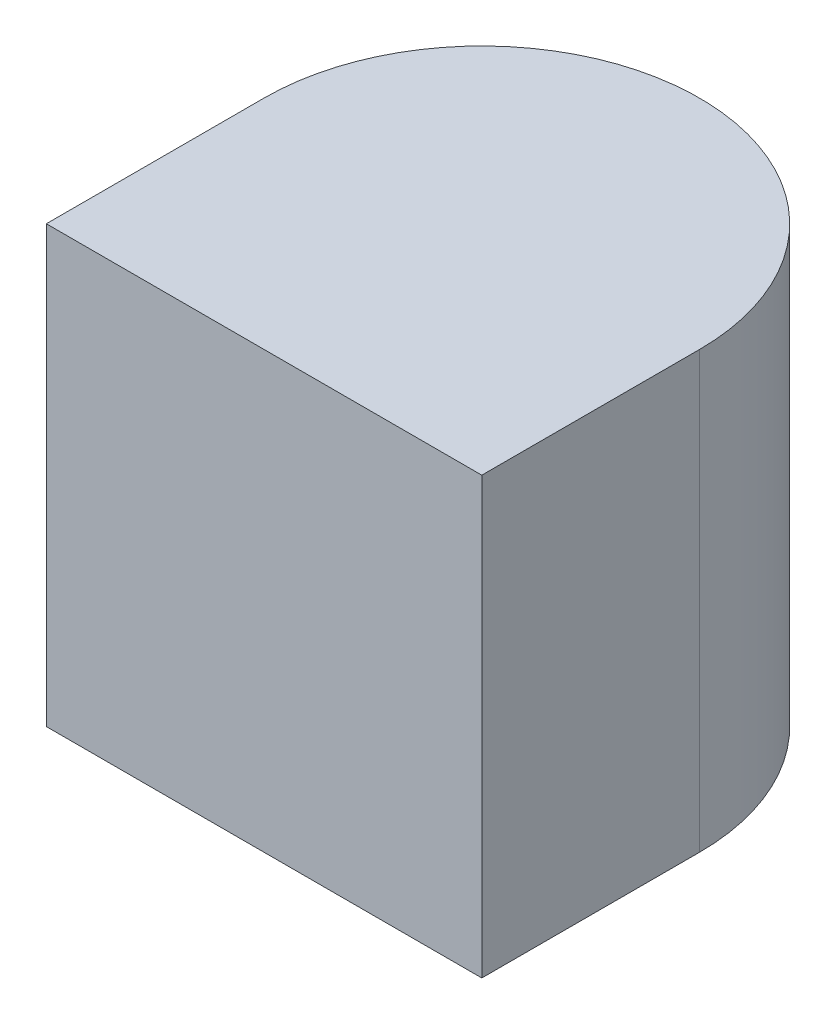
ISO-10303-21;
HEADER;
FILE_DESCRIPTION(('STEP AP214'),'2;1');
FILE_NAME('part.step','',(''),(''),'','','');
FILE_SCHEMA(('AUTOMOTIVE_DESIGN { 1 0 10303 214 1 1 1 1 }'));
ENDSEC;
DATA;
#1=APPLICATION_CONTEXT('core data for automotive mechanical design processes');
#2=APPLICATION_PROTOCOL_DEFINITION('international standard','automotive_design',2000,#1);
#3=PRODUCT_CONTEXT('',#1,'mechanical');
#4=PRODUCT('Part','Part','',(#3));
#5=PRODUCT_RELATED_PRODUCT_CATEGORY('part','',(#4));
#6=PRODUCT_DEFINITION_FORMATION('','',#4);
#7=PRODUCT_DEFINITION_CONTEXT('part definition',#1,'design');
#8=PRODUCT_DEFINITION('design','',#6,#7);
#9=PRODUCT_DEFINITION_SHAPE('','',#8);
#10=(LENGTH_UNIT() NAMED_UNIT(*) SI_UNIT(.MILLI.,.METRE.));
#11=(NAMED_UNIT(*) PLANE_ANGLE_UNIT() SI_UNIT($,.RADIAN.));
#12=(NAMED_UNIT(*) SI_UNIT($,.STERADIAN.) SOLID_ANGLE_UNIT());
#13=UNCERTAINTY_MEASURE_WITH_UNIT(LENGTH_MEASURE(1.E-05),#10,'distance_accuracy_value','');
#14=(GEOMETRIC_REPRESENTATION_CONTEXT(3) GLOBAL_UNCERTAINTY_ASSIGNED_CONTEXT((#13)) GLOBAL_UNIT_ASSIGNED_CONTEXT((#10,
#11,#12)) REPRESENTATION_CONTEXT('',''));
#15=CARTESIAN_POINT('',(0.,0.,0.));
#16=DIRECTION('',(0.,0.,1.));
#17=DIRECTION('',(1.,0.,0.));
#18=AXIS2_PLACEMENT_3D('',#15,#16,#17);
#19=CARTESIAN_POINT('',(-10.,20.,20.));
#20=DIRECTION('',(1.,0.,0.));
#21=DIRECTION('',(0.,0.,-1.));
#22=AXIS2_PLACEMENT_3D('',#19,#20,#21);
#23=PLANE('',#22);
#24=DIRECTION('',(0.,0.,1.));
#25=VECTOR('',#24,1.);
#26=CARTESIAN_POINT('',(-10.,0.,20.));
#27=LINE('',#26,#25);
#28=CARTESIAN_POINT('',(-10.,0.,10.));
#29=VERTEX_POINT('',#28);
#30=CARTESIAN_POINT('',(-10.,0.,20.));
#31=VERTEX_POINT('',#30);
#32=EDGE_CURVE('E100',#29,#31,#27,.T.);
#33=ORIENTED_EDGE('',*,*,#32,.T.);
#34=DIRECTION('',(0.,-1.,0.));
#35=VECTOR('',#34,1.);
#36=CARTESIAN_POINT('',(-10.,20.,20.));
#37=LINE('',#36,#35);
#38=CARTESIAN_POINT('',(-10.,20.,20.));
#39=VERTEX_POINT('',#38);
#40=EDGE_CURVE('E11',#39,#31,#37,.T.);
#41=ORIENTED_EDGE('',*,*,#40,.F.);
#42=DIRECTION('',(0.,0.,1.));
#43=VECTOR('',#42,1.);
#44=CARTESIAN_POINT('',(-10.,20.,20.));
#45=LINE('',#44,#43);
#46=CARTESIAN_POINT('',(-10.,20.,10.));
#47=VERTEX_POINT('',#46);
#48=EDGE_CURVE('E88',#47,#39,#45,.T.);
#49=ORIENTED_EDGE('',*,*,#48,.F.);
#50=DIRECTION('',(0.,-1.,0.));
#51=VECTOR('',#50,1.);
#52=CARTESIAN_POINT('',(-10.,20.,10.));
#53=LINE('',#52,#51);
#54=EDGE_CURVE('E96',#47,#29,#53,.T.);
#55=ORIENTED_EDGE('',*,*,#54,.T.);
#56=EDGE_LOOP('',(#33,#41,#49,#55));
#57=FACE_BOUND('',#56,.T.);
#58=ADVANCED_FACE('F37',(#57),#23,.F.);
#59=CARTESIAN_POINT('',(-10.,20.,20.));
#60=DIRECTION('',(0.,0.,-1.));
#61=DIRECTION('',(-1.,0.,0.));
#62=AXIS2_PLACEMENT_3D('',#59,#60,#61);
#63=PLANE('',#62);
#64=DIRECTION('',(1.,0.,0.));
#65=VECTOR('',#64,1.);
#66=CARTESIAN_POINT('',(-10.,0.,20.));
#67=LINE('',#66,#65);
#68=CARTESIAN_POINT('',(10.,0.,20.));
#69=VERTEX_POINT('',#68);
#70=EDGE_CURVE('E92',#31,#69,#67,.T.);
#71=ORIENTED_EDGE('',*,*,#70,.T.);
#72=DIRECTION('',(0.,-1.,0.));
#73=VECTOR('',#72,1.);
#74=CARTESIAN_POINT('',(10.,20.,20.));
#75=LINE('',#74,#73);
#76=CARTESIAN_POINT('',(10.,20.,20.));
#77=VERTEX_POINT('',#76);
#78=EDGE_CURVE('E45',#77,#69,#75,.T.);
#79=ORIENTED_EDGE('',*,*,#78,.F.);
#80=DIRECTION('',(1.,0.,0.));
#81=VECTOR('',#80,1.);
#82=CARTESIAN_POINT('',(-10.,20.,20.));
#83=LINE('',#82,#81);
#84=EDGE_CURVE('E83',#39,#77,#83,.T.);
#85=ORIENTED_EDGE('',*,*,#84,.F.);
#86=ORIENTED_EDGE('',*,*,#40,.T.);
#87=EDGE_LOOP('',(#71,#79,#85,#86));
#88=FACE_BOUND('',#87,.T.);
#89=ADVANCED_FACE('F91',(#88),#63,.F.);
#90=CARTESIAN_POINT('',(10.,20.,20.));
#91=DIRECTION('',(-1.,0.,0.));
#92=DIRECTION('',(0.,0.,1.));
#93=AXIS2_PLACEMENT_3D('',#90,#91,#92);
#94=PLANE('',#93);
#95=DIRECTION('',(0.,0.,-1.));
#96=VECTOR('',#95,1.);
#97=CARTESIAN_POINT('',(10.,0.,20.));
#98=LINE('',#97,#96);
#99=CARTESIAN_POINT('',(10.,0.,10.));
#100=VERTEX_POINT('',#99);
#101=EDGE_CURVE('E70',#69,#100,#98,.T.);
#102=ORIENTED_EDGE('',*,*,#101,.T.);
#103=DIRECTION('',(0.,-1.,0.));
#104=VECTOR('',#103,1.);
#105=CARTESIAN_POINT('',(10.,20.,10.));
#106=LINE('',#105,#104);
#107=CARTESIAN_POINT('',(10.,20.,10.));
#108=VERTEX_POINT('',#107);
#109=EDGE_CURVE('E93',#108,#100,#106,.T.);
#110=ORIENTED_EDGE('',*,*,#109,.F.);
#111=DIRECTION('',(0.,0.,-1.));
#112=VECTOR('',#111,1.);
#113=CARTESIAN_POINT('',(10.,20.,20.));
#114=LINE('',#113,#112);
#115=EDGE_CURVE('E86',#77,#108,#114,.T.);
#116=ORIENTED_EDGE('',*,*,#115,.F.);
#117=ORIENTED_EDGE('',*,*,#78,.T.);
#118=EDGE_LOOP('',(#102,#110,#116,#117));
#119=FACE_BOUND('',#118,.T.);
#120=ADVANCED_FACE('F94',(#119),#94,.F.);
#121=CARTESIAN_POINT('',(0.,20.,10.));
#122=DIRECTION('',(0.,-1.,0.));
#123=DIRECTION('',(0.,0.,-1.));
#124=AXIS2_PLACEMENT_3D('',#121,#122,#123);
#125=CYLINDRICAL_SURFACE('',#124,10.);
#126=CARTESIAN_POINT('',(0.,0.,10.));
#127=DIRECTION('',(0.,1.,0.));
#128=DIRECTION('',(0.,0.,-1.));
#129=AXIS2_PLACEMENT_3D('',#126,#127,#128);
#130=CIRCLE('',#129,10.);
#131=EDGE_CURVE('E76',#100,#29,#130,.T.);
#132=ORIENTED_EDGE('',*,*,#131,.T.);
#133=ORIENTED_EDGE('',*,*,#54,.F.);
#134=CARTESIAN_POINT('',(0.,20.,10.));
#135=DIRECTION('',(0.,1.,0.));
#136=DIRECTION('',(0.,0.,-1.));
#137=AXIS2_PLACEMENT_3D('',#134,#135,#136);
#138=CIRCLE('',#137,10.);
#139=EDGE_CURVE('E53',#108,#47,#138,.T.);
#140=ORIENTED_EDGE('',*,*,#139,.F.);
#141=ORIENTED_EDGE('',*,*,#109,.T.);
#142=EDGE_LOOP('',(#132,#133,#140,#141));
#143=FACE_BOUND('',#142,.T.);
#144=ADVANCED_FACE('F107',(#143),#125,.T.);
#145=CARTESIAN_POINT('',(0.,20.,10.));
#146=DIRECTION('',(0.,-1.,0.));
#147=DIRECTION('',(0.,0.,-1.));
#148=AXIS2_PLACEMENT_3D('',#145,#146,#147);
#149=PLANE('',#148);
#150=ORIENTED_EDGE('',*,*,#48,.T.);
#151=ORIENTED_EDGE('',*,*,#84,.T.);
#152=ORIENTED_EDGE('',*,*,#115,.T.);
#153=ORIENTED_EDGE('',*,*,#139,.T.);
#154=EDGE_LOOP('',(#150,#151,#152,#153));
#155=FACE_BOUND('',#154,.T.);
#156=ADVANCED_FACE('F84',(#155),#149,.F.);
#157=CARTESIAN_POINT('',(0.,0.,10.));
#158=DIRECTION('',(0.,-1.,0.));
#159=DIRECTION('',(0.,0.,-1.));
#160=AXIS2_PLACEMENT_3D('',#157,#158,#159);
#161=PLANE('',#160);
#162=ORIENTED_EDGE('',*,*,#32,.F.);
#163=ORIENTED_EDGE('',*,*,#131,.F.);
#164=ORIENTED_EDGE('',*,*,#101,.F.);
#165=ORIENTED_EDGE('',*,*,#70,.F.);
#166=EDGE_LOOP('',(#162,#163,#164,#165));
#167=FACE_BOUND('',#166,.T.);
#168=ADVANCED_FACE('F110',(#167),#161,.T.);
#169=CLOSED_SHELL('',(#58,#89,#120,#144,#156,#168));
#170=MANIFOLD_SOLID_BREP('B2',#169);
#171=ADVANCED_BREP_SHAPE_REPRESENTATION('',(#18,#170),#14);
#172=SHAPE_DEFINITION_REPRESENTATION(#9,#171);
ENDSEC;
END-ISO-10303-21;
